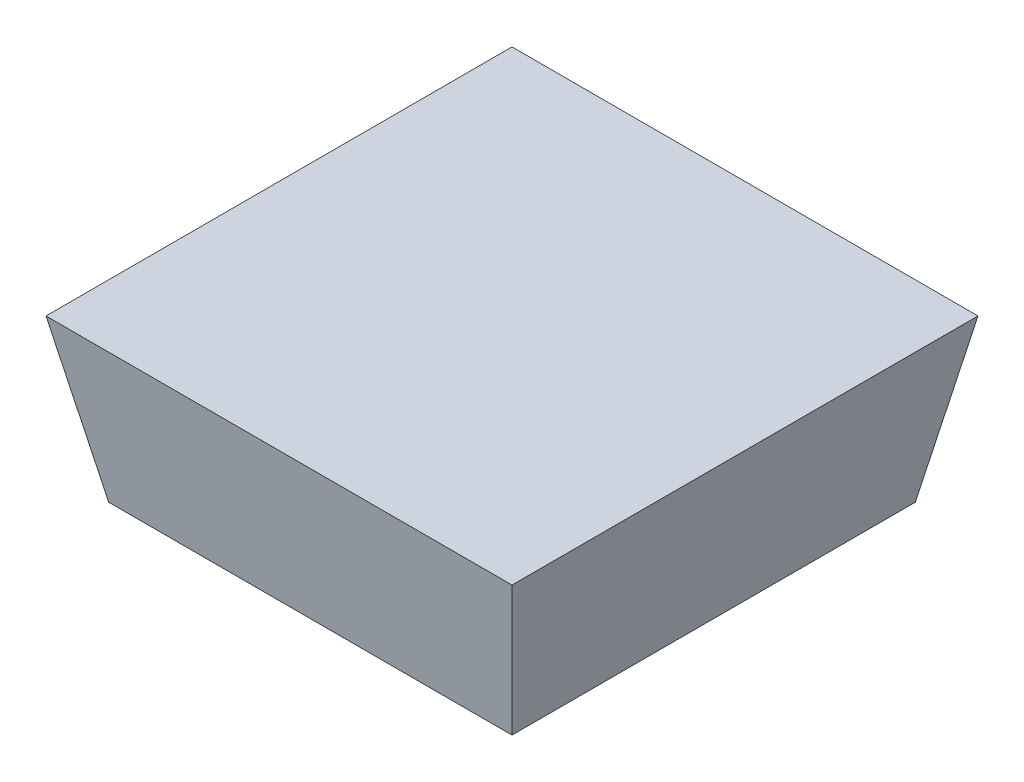
ISO-10303-21;
HEADER;
FILE_DESCRIPTION(('STEP AP214'),'2;1');
FILE_NAME('part.step','',(''),(''),'','','');
FILE_SCHEMA(('AUTOMOTIVE_DESIGN { 1 0 10303 214 1 1 1 1 }'));
ENDSEC;
DATA;
#1=APPLICATION_CONTEXT('core data for automotive mechanical design processes');
#2=APPLICATION_PROTOCOL_DEFINITION('international standard','automotive_design',2000,#1);
#3=PRODUCT_CONTEXT('',#1,'mechanical');
#4=PRODUCT('Part','Part','',(#3));
#5=PRODUCT_RELATED_PRODUCT_CATEGORY('part','',(#4));
#6=PRODUCT_DEFINITION_FORMATION('','',#4);
#7=PRODUCT_DEFINITION_CONTEXT('part definition',#1,'design');
#8=PRODUCT_DEFINITION('design','',#6,#7);
#9=PRODUCT_DEFINITION_SHAPE('','',#8);
#10=(LENGTH_UNIT() NAMED_UNIT(*) SI_UNIT(.MILLI.,.METRE.));
#11=(NAMED_UNIT(*) PLANE_ANGLE_UNIT() SI_UNIT($,.RADIAN.));
#12=(NAMED_UNIT(*) SI_UNIT($,.STERADIAN.) SOLID_ANGLE_UNIT());
#13=UNCERTAINTY_MEASURE_WITH_UNIT(LENGTH_MEASURE(1.E-05),#10,'distance_accuracy_value','');
#14=(GEOMETRIC_REPRESENTATION_CONTEXT(3) GLOBAL_UNCERTAINTY_ASSIGNED_CONTEXT((#13)) GLOBAL_UNIT_ASSIGNED_CONTEXT((#10,
#11,#12)) REPRESENTATION_CONTEXT('',''));
#15=CARTESIAN_POINT('',(0.,0.,0.));
#16=DIRECTION('',(0.,0.,1.));
#17=DIRECTION('',(1.,0.,0.));
#18=AXIS2_PLACEMENT_3D('',#15,#16,#17);
#19=CARTESIAN_POINT('',(0.,0.,0.));
#20=DIRECTION('',(0.,1.,0.));
#21=DIRECTION('',(0.,0.,1.));
#22=AXIS2_PLACEMENT_3D('',#19,#20,#21);
#23=PLANE('',#22);
#24=DIRECTION('',(0.,0.,1.));
#25=VECTOR('',#24,1.);
#26=CARTESIAN_POINT('',(-17.2924493631929,0.,-11.3623726074239));
#27=LINE('',#26,#25);
#28=CARTESIAN_POINT('',(-17.2924493631929,0.,-11.3623726074239));
#29=VERTEX_POINT('',#28);
#30=CARTESIAN_POINT('',(-17.2924493631929,0.,13.6376273925761));
#31=VERTEX_POINT('',#30);
#32=EDGE_CURVE('E193',#29,#31,#27,.T.);
#33=ORIENTED_EDGE('',*,*,#32,.F.);
#34=DIRECTION('',(-1.,0.,0.));
#35=VECTOR('',#34,1.);
#36=CARTESIAN_POINT('',(-17.2924493631929,0.,-11.3623726074239));
#37=LINE('',#36,#35);
#38=CARTESIAN_POINT('',(7.7075506368071,0.,-11.3623726074239));
#39=VERTEX_POINT('',#38);
#40=EDGE_CURVE('E225',#39,#29,#37,.T.);
#41=ORIENTED_EDGE('',*,*,#40,.F.);
#42=DIRECTION('',(0.,0.,-1.));
#43=VECTOR('',#42,1.);
#44=CARTESIAN_POINT('',(7.7075506368071,0.,-11.3623726074239));
#45=LINE('',#44,#43);
#46=CARTESIAN_POINT('',(7.70755063680711,0.,13.6376273925761));
#47=VERTEX_POINT('',#46);
#48=EDGE_CURVE('E218',#47,#39,#45,.T.);
#49=ORIENTED_EDGE('',*,*,#48,.F.);
#50=DIRECTION('',(1.,0.,0.));
#51=VECTOR('',#50,1.);
#52=CARTESIAN_POINT('',(-17.2924493631929,0.,13.6376273925761));
#53=LINE('',#52,#51);
#54=EDGE_CURVE('E216',#31,#47,#53,.T.);
#55=ORIENTED_EDGE('',*,*,#54,.F.);
#56=EDGE_LOOP('',(#33,#41,#49,#55));
#57=FACE_BOUND('',#56,.T.);
#58=DIRECTION('',(0.,0.,1.));
#59=VECTOR('',#58,1.);
#60=CARTESIAN_POINT('',(-15.1796771975961,0.,0.));
#61=LINE('',#60,#59);
#62=CARTESIAN_POINT('',(-15.1796771975961,0.,11.5248552269793));
#63=VERTEX_POINT('',#62);
#64=CARTESIAN_POINT('',(-15.1796771975961,0.,-9.24960044182707));
#65=VERTEX_POINT('',#64);
#66=EDGE_CURVE('E12',#63,#65,#61,.F.);
#67=ORIENTED_EDGE('',*,*,#66,.F.);
#68=DIRECTION('',(1.,0.,0.));
#69=VECTOR('',#68,1.);
#70=CARTESIAN_POINT('',(0.,0.,11.5248552269793));
#71=LINE('',#70,#69);
#72=CARTESIAN_POINT('',(5.59477847121029,0.,11.5248552269793));
#73=VERTEX_POINT('',#72);
#74=EDGE_CURVE('E63',#73,#63,#71,.F.);
#75=ORIENTED_EDGE('',*,*,#74,.F.);
#76=DIRECTION('',(0.,0.,-1.));
#77=VECTOR('',#76,1.);
#78=CARTESIAN_POINT('',(5.59477847121029,0.,0.));
#79=LINE('',#78,#77);
#80=CARTESIAN_POINT('',(5.59477847121029,0.,-9.24960044182707));
#81=VERTEX_POINT('',#80);
#82=EDGE_CURVE('E268',#81,#73,#79,.F.);
#83=ORIENTED_EDGE('',*,*,#82,.F.);
#84=DIRECTION('',(-1.,0.,0.));
#85=VECTOR('',#84,1.);
#86=CARTESIAN_POINT('',(0.,0.,-9.24960044182707));
#87=LINE('',#86,#85);
#88=EDGE_CURVE('E264',#65,#81,#87,.F.);
#89=ORIENTED_EDGE('',*,*,#88,.F.);
#90=EDGE_LOOP('',(#67,#75,#83,#89));
#91=FACE_BOUND('',#90,.T.);
#92=ADVANCED_FACE('F57',(#57,#91),#23,.F.);
#93=CARTESIAN_POINT('',(-17.2924493631929,0.,-11.3623726074239));
#94=DIRECTION('',(-0.981627183447664,-0.190808995376545,0.));
#95=DIRECTION('',(0.190808995376545,-0.981627183447664,0.));
#96=AXIS2_PLACEMENT_3D('',#93,#94,#95);
#97=PLANE('',#96);
#98=ORIENTED_EDGE('',*,*,#32,.T.);
#99=DIRECTION('',(0.187427559991896,-0.964231206459824,-0.187427559991896));
#100=VECTOR('',#99,1.);
#101=CARTESIAN_POINT('',(-17.2924493631929,0.,13.6376273925761));
#102=LINE('',#101,#100);
#103=CARTESIAN_POINT('',(-19.2362524545701,10.,15.5814304839533));
#104=VERTEX_POINT('',#103);
#105=EDGE_CURVE('E227',#104,#31,#102,.T.);
#106=ORIENTED_EDGE('',*,*,#105,.F.);
#107=DIRECTION('',(0.,0.,-1.));
#108=VECTOR('',#107,1.);
#109=CARTESIAN_POINT('',(-19.2362524545701,10.,-11.3623726074239));
#110=LINE('',#109,#108);
#111=CARTESIAN_POINT('',(-19.2362524545701,10.,-13.3061756988011));
#112=VERTEX_POINT('',#111);
#113=EDGE_CURVE('E223',#112,#104,#110,.F.);
#114=ORIENTED_EDGE('',*,*,#113,.F.);
#115=DIRECTION('',(0.187427559991896,-0.964231206459824,0.187427559991896));
#116=VECTOR('',#115,1.);
#117=CARTESIAN_POINT('',(-17.2924493631929,0.,-11.3623726074239));
#118=LINE('',#117,#116);
#119=EDGE_CURVE('E232',#112,#29,#118,.T.);
#120=ORIENTED_EDGE('',*,*,#119,.T.);
#121=EDGE_LOOP('',(#98,#106,#114,#120));
#122=FACE_BOUND('',#121,.T.);
#123=ADVANCED_FACE('F302',(#122),#97,.T.);
#124=CARTESIAN_POINT('',(-17.2924493631929,0.,13.6376273925761));
#125=DIRECTION('',(0.,-0.190808995376545,0.981627183447664));
#126=DIRECTION('',(0.,-0.981627183447664,-0.190808995376545));
#127=AXIS2_PLACEMENT_3D('',#124,#125,#126);
#128=PLANE('',#127);
#129=ORIENTED_EDGE('',*,*,#54,.T.);
#130=DIRECTION('',(-0.187427559991896,-0.964231206459824,-0.187427559991896));
#131=VECTOR('',#130,1.);
#132=CARTESIAN_POINT('',(6.82932338069421,-4.51808755737018,12.7594001364632));
#133=LINE('',#132,#131);
#134=CARTESIAN_POINT('',(9.6513537281843,10.,15.5814304839533));
#135=VERTEX_POINT('',#134);
#136=EDGE_CURVE('E228',#135,#47,#133,.T.);
#137=ORIENTED_EDGE('',*,*,#136,.F.);
#138=DIRECTION('',(-1.,0.,0.));
#139=VECTOR('',#138,1.);
#140=CARTESIAN_POINT('',(-17.2924493631929,10.,15.5814304839533));
#141=LINE('',#140,#139);
#142=EDGE_CURVE('E247',#104,#135,#141,.F.);
#143=ORIENTED_EDGE('',*,*,#142,.F.);
#144=ORIENTED_EDGE('',*,*,#105,.T.);
#145=EDGE_LOOP('',(#129,#137,#143,#144));
#146=FACE_BOUND('',#145,.T.);
#147=ADVANCED_FACE('F59',(#146),#128,.T.);
#148=CARTESIAN_POINT('',(7.7075506368071,0.,-11.3623726074239));
#149=DIRECTION('',(0.981627183447664,-0.190808995376545,0.));
#150=DIRECTION('',(0.190808995376545,0.981627183447664,0.));
#151=AXIS2_PLACEMENT_3D('',#148,#149,#150);
#152=PLANE('',#151);
#153=ORIENTED_EDGE('',*,*,#48,.T.);
#154=DIRECTION('',(-0.187427559991896,-0.964231206459824,0.187427559991896));
#155=VECTOR('',#154,1.);
#156=CARTESIAN_POINT('',(6.82932338069421,-4.51808755737018,-10.484145351311));
#157=LINE('',#156,#155);
#158=CARTESIAN_POINT('',(9.65135372818429,10.,-13.3061756988011));
#159=VERTEX_POINT('',#158);
#160=EDGE_CURVE('E231',#159,#39,#157,.T.);
#161=ORIENTED_EDGE('',*,*,#160,.F.);
#162=DIRECTION('',(0.,0.,1.));
#163=VECTOR('',#162,1.);
#164=CARTESIAN_POINT('',(9.65135372818429,10.,-11.3623726074239));
#165=LINE('',#164,#163);
#166=EDGE_CURVE('E249',#135,#159,#165,.F.);
#167=ORIENTED_EDGE('',*,*,#166,.F.);
#168=ORIENTED_EDGE('',*,*,#136,.T.);
#169=EDGE_LOOP('',(#153,#161,#167,#168));
#170=FACE_BOUND('',#169,.T.);
#171=ADVANCED_FACE('F320',(#170),#152,.T.);
#172=CARTESIAN_POINT('',(-17.2924493631929,0.,-11.3623726074239));
#173=DIRECTION('',(0.,-0.190808995376545,-0.981627183447664));
#174=DIRECTION('',(0.,0.981627183447664,-0.190808995376545));
#175=AXIS2_PLACEMENT_3D('',#172,#173,#174);
#176=PLANE('',#175);
#177=ORIENTED_EDGE('',*,*,#40,.T.);
#178=ORIENTED_EDGE('',*,*,#119,.F.);
#179=DIRECTION('',(1.,0.,0.));
#180=VECTOR('',#179,1.);
#181=CARTESIAN_POINT('',(-17.2924493631929,10.,-13.3061756988011));
#182=LINE('',#181,#180);
#183=EDGE_CURVE('E237',#159,#112,#182,.F.);
#184=ORIENTED_EDGE('',*,*,#183,.F.);
#185=ORIENTED_EDGE('',*,*,#160,.T.);
#186=EDGE_LOOP('',(#177,#178,#184,#185));
#187=FACE_BOUND('',#186,.T.);
#188=ADVANCED_FACE('F312',(#187),#176,.T.);
#189=CARTESIAN_POINT('',(0.,10.,0.));
#190=DIRECTION('',(0.,1.,0.));
#191=DIRECTION('',(0.,0.,1.));
#192=AXIS2_PLACEMENT_3D('',#189,#190,#191);
#193=PLANE('',#192);
#194=ORIENTED_EDGE('',*,*,#113,.T.);
#195=ORIENTED_EDGE('',*,*,#142,.T.);
#196=ORIENTED_EDGE('',*,*,#166,.T.);
#197=ORIENTED_EDGE('',*,*,#183,.T.);
#198=EDGE_LOOP('',(#194,#195,#196,#197));
#199=FACE_BOUND('',#198,.T.);
#200=ADVANCED_FACE('F315',(#199),#193,.T.);
#201=CARTESIAN_POINT('',(-17.2924493631929,-9.93981154473478,-11.3623726074239));
#202=DIRECTION('',(-0.978147600733806,0.207911690817759,0.));
#203=DIRECTION('',(-0.207911690817759,-0.978147600733806,0.));
#204=AXIS2_PLACEMENT_3D('',#201,#202,#203);
#205=PLANE('',#204);
#206=ORIENTED_EDGE('',*,*,#66,.T.);
#207=DIRECTION('',(-0.203558594952779,-0.957667894857973,-0.203558594952779));
#208=VECTOR('',#207,1.);
#209=CARTESIAN_POINT('',(-17.2924493631929,-9.93981154473478,-11.3623726074239));
#210=LINE('',#209,#208);
#211=CARTESIAN_POINT('',(-14.1041009381426,5.06018845526522,-8.17402418237355));
#212=VERTEX_POINT('',#211);
#213=EDGE_CURVE('E75',#212,#65,#210,.T.);
#214=ORIENTED_EDGE('',*,*,#213,.F.);
#215=DIRECTION('',(0.,0.,-1.));
#216=VECTOR('',#215,1.);
#217=CARTESIAN_POINT('',(-14.1041009381426,5.06018845526522,-11.3623726074239));
#218=LINE('',#217,#216);
#219=CARTESIAN_POINT('',(-14.1041009381426,5.06018845526522,10.4492789675258));
#220=VERTEX_POINT('',#219);
#221=EDGE_CURVE('E205',#212,#220,#218,.F.);
#222=ORIENTED_EDGE('',*,*,#221,.T.);
#223=DIRECTION('',(-0.203558594952779,-0.957667894857973,0.203558594952779));
#224=VECTOR('',#223,1.);
#225=CARTESIAN_POINT('',(-16.7744980934535,-7.50304240587635,13.1196761228367));
#226=LINE('',#225,#224);
#227=EDGE_CURVE('E187',#220,#63,#226,.T.);
#228=ORIENTED_EDGE('',*,*,#227,.T.);
#229=EDGE_LOOP('',(#206,#214,#222,#228));
#230=FACE_BOUND('',#229,.T.);
#231=ADVANCED_FACE('F282',(#230),#205,.F.);
#232=CARTESIAN_POINT('',(-4.79244936319291,-9.93981154473478,13.6376273925761));
#233=DIRECTION('',(0.,0.207911690817759,0.978147600733806));
#234=DIRECTION('',(0.,-0.978147600733806,0.207911690817759));
#235=AXIS2_PLACEMENT_3D('',#232,#233,#234);
#236=PLANE('',#235);
#237=ORIENTED_EDGE('',*,*,#74,.T.);
#238=ORIENTED_EDGE('',*,*,#227,.F.);
#239=DIRECTION('',(-1.,0.,0.));
#240=VECTOR('',#239,1.);
#241=CARTESIAN_POINT('',(-4.79244936319291,5.06018845526522,10.4492789675258));
#242=LINE('',#241,#240);
#243=CARTESIAN_POINT('',(4.51920221175677,5.06018845526522,10.4492789675258));
#244=VERTEX_POINT('',#243);
#245=EDGE_CURVE('E202',#220,#244,#242,.F.);
#246=ORIENTED_EDGE('',*,*,#245,.T.);
#247=DIRECTION('',(0.203558594952779,-0.957667894857973,0.203558594952779));
#248=VECTOR('',#247,1.);
#249=CARTESIAN_POINT('',(6.67164809732837,-5.06627326701791,12.6017248530974));
#250=LINE('',#249,#248);
#251=EDGE_CURVE('E188',#244,#73,#250,.T.);
#252=ORIENTED_EDGE('',*,*,#251,.T.);
#253=EDGE_LOOP('',(#237,#238,#246,#252));
#254=FACE_BOUND('',#253,.T.);
#255=ADVANCED_FACE('F273',(#254),#236,.F.);
#256=CARTESIAN_POINT('',(7.7075506368071,-9.93981154473478,-11.3623726074239));
#257=DIRECTION('',(0.978147600733806,0.207911690817759,0.));
#258=DIRECTION('',(-0.207911690817759,0.978147600733806,0.));
#259=AXIS2_PLACEMENT_3D('',#256,#257,#258);
#260=PLANE('',#259);
#261=ORIENTED_EDGE('',*,*,#82,.T.);
#262=ORIENTED_EDGE('',*,*,#251,.F.);
#263=DIRECTION('',(0.,0.,1.));
#264=VECTOR('',#263,1.);
#265=CARTESIAN_POINT('',(4.51920221175677,5.06018845526522,-11.3623726074239));
#266=LINE('',#265,#264);
#267=CARTESIAN_POINT('',(4.51920221175677,5.06018845526522,-8.17402418237355));
#268=VERTEX_POINT('',#267);
#269=EDGE_CURVE('E196',#244,#268,#266,.F.);
#270=ORIENTED_EDGE('',*,*,#269,.T.);
#271=DIRECTION('',(0.203558594952779,-0.957667894857973,-0.203558594952779));
#272=VECTOR('',#271,1.);
#273=CARTESIAN_POINT('',(7.08600911311986,-7.01568857810466,-10.7408310837366));
#274=LINE('',#273,#272);
#275=EDGE_CURVE('E194',#268,#81,#274,.T.);
#276=ORIENTED_EDGE('',*,*,#275,.T.);
#277=EDGE_LOOP('',(#261,#262,#270,#276));
#278=FACE_BOUND('',#277,.T.);
#279=ADVANCED_FACE('F287',(#278),#260,.F.);
#280=CARTESIAN_POINT('',(-7.2924493631929,-9.93981154473478,-11.3623726074239));
#281=DIRECTION('',(0.,0.207911690817759,-0.978147600733806));
#282=DIRECTION('',(0.,0.978147600733806,0.207911690817759));
#283=AXIS2_PLACEMENT_3D('',#280,#281,#282);
#284=PLANE('',#283);
#285=ORIENTED_EDGE('',*,*,#88,.T.);
#286=ORIENTED_EDGE('',*,*,#275,.F.);
#287=DIRECTION('',(1.,0.,0.));
#288=VECTOR('',#287,1.);
#289=CARTESIAN_POINT('',(-7.2924493631929,5.06018845526522,-8.17402418237355));
#290=LINE('',#289,#288);
#291=EDGE_CURVE('E182',#268,#212,#290,.F.);
#292=ORIENTED_EDGE('',*,*,#291,.T.);
#293=ORIENTED_EDGE('',*,*,#213,.T.);
#294=EDGE_LOOP('',(#285,#286,#292,#293));
#295=FACE_BOUND('',#294,.T.);
#296=ADVANCED_FACE('F281',(#295),#284,.F.);
#297=CARTESIAN_POINT('',(-6.51710999317277,5.06018845526522,-6.17402418237355));
#298=DIRECTION('',(0.,-0.20791169081776,-0.978147600733805));
#299=DIRECTION('',(0.,0.978147600733806,-0.20791169081776));
#300=AXIS2_PLACEMENT_3D('',#297,#298,#299);
#301=PLANE('',#300);
#302=DIRECTION('',(-1.,0.,0.));
#303=VECTOR('',#302,1.);
#304=CARTESIAN_POINT('',(0.,0.,-5.09844792292003));
#305=LINE('',#304,#303);
#306=CARTESIAN_POINT('',(1.44362595230325,0.,-5.09844792292003));
#307=VERTEX_POINT('',#306);
#308=CARTESIAN_POINT('',(-11.028524678689,0.,-5.09844792292003));
#309=VERTEX_POINT('',#308);
#310=EDGE_CURVE('E265',#307,#309,#305,.T.);
#311=ORIENTED_EDGE('',*,*,#310,.T.);
#312=DIRECTION('',(-0.203558594952779,0.957667894857973,-0.203558594952779));
#313=VECTOR('',#312,1.);
#314=CARTESIAN_POINT('',(-11.872597813825,3.97105188616251,-5.94252105805599));
#315=LINE('',#314,#313);
#316=CARTESIAN_POINT('',(-12.1041009381426,5.06018845526522,-6.17402418237355));
#317=VERTEX_POINT('',#316);
#318=EDGE_CURVE('E76',#309,#317,#315,.T.);
#319=ORIENTED_EDGE('',*,*,#318,.T.);
#320=DIRECTION('',(-1.,0.,0.));
#321=VECTOR('',#320,1.);
#322=CARTESIAN_POINT('',(-6.51710999317277,5.06018845526522,-6.17402418237355));
#323=LINE('',#322,#321);
#324=CARTESIAN_POINT('',(2.51920221175677,5.06018845526522,-6.17402418237355));
#325=VERTEX_POINT('',#324);
#326=EDGE_CURVE('E164',#325,#317,#323,.T.);
#327=ORIENTED_EDGE('',*,*,#326,.F.);
#328=DIRECTION('',(0.203558594952779,0.957667894857973,-0.203558594952779));
#329=VECTOR('',#328,1.);
#330=CARTESIAN_POINT('',(2.51920221175677,5.06018845526522,-6.17402418237355));
#331=LINE('',#330,#329);
#332=EDGE_CURVE('E178',#307,#325,#331,.T.);
#333=ORIENTED_EDGE('',*,*,#332,.F.);
#334=EDGE_LOOP('',(#311,#319,#327,#333));
#335=FACE_BOUND('',#334,.T.);
#336=ADVANCED_FACE('F343',(#335),#301,.T.);
#337=CARTESIAN_POINT('',(2.51920221175677,5.06018845526522,-6.17402418237355));
#338=DIRECTION('',(0.978147600733806,-0.20791169081776,0.));
#339=DIRECTION('',(0.20791169081776,0.978147600733806,0.));
#340=AXIS2_PLACEMENT_3D('',#337,#338,#339);
#341=PLANE('',#340);
#342=DIRECTION('',(0.,0.,-1.));
#343=VECTOR('',#342,1.);
#344=CARTESIAN_POINT('',(1.44362595230326,0.,0.));
#345=LINE('',#344,#343);
#346=CARTESIAN_POINT('',(1.44362595230326,0.,7.37370270807226));
#347=VERTEX_POINT('',#346);
#348=EDGE_CURVE('E259',#347,#307,#345,.T.);
#349=ORIENTED_EDGE('',*,*,#348,.T.);
#350=ORIENTED_EDGE('',*,*,#332,.T.);
#351=DIRECTION('',(0.,0.,-1.));
#352=VECTOR('',#351,1.);
#353=CARTESIAN_POINT('',(2.51920221175677,5.06018845526522,-6.17402418237355));
#354=LINE('',#353,#352);
#355=CARTESIAN_POINT('',(2.51920221175678,5.06018845526522,8.44927896752578));
#356=VERTEX_POINT('',#355);
#357=EDGE_CURVE('E172',#356,#325,#354,.T.);
#358=ORIENTED_EDGE('',*,*,#357,.F.);
#359=DIRECTION('',(0.203558594952779,0.957667894857973,0.203558594952779));
#360=VECTOR('',#359,1.);
#361=CARTESIAN_POINT('',(2.14477266133241,3.29863591846025,8.07484941710141));
#362=LINE('',#361,#360);
#363=EDGE_CURVE('E152',#347,#356,#362,.T.);
#364=ORIENTED_EDGE('',*,*,#363,.F.);
#365=EDGE_LOOP('',(#349,#350,#358,#364));
#366=FACE_BOUND('',#365,.T.);
#367=ADVANCED_FACE('F362',(#366),#341,.T.);
#368=CARTESIAN_POINT('',(-6.51710999317276,5.06018845526522,8.44927896752578));
#369=DIRECTION('',(0.,-0.20791169081776,0.978147600733805));
#370=DIRECTION('',(0.,-0.978147600733806,-0.20791169081776));
#371=AXIS2_PLACEMENT_3D('',#368,#369,#370);
#372=PLANE('',#371);
#373=DIRECTION('',(1.,0.,0.));
#374=VECTOR('',#373,1.);
#375=CARTESIAN_POINT('',(0.,0.,7.37370270807226));
#376=LINE('',#375,#374);
#377=CARTESIAN_POINT('',(-11.028524678689,0.,7.37370270807226));
#378=VERTEX_POINT('',#377);
#379=EDGE_CURVE('E258',#378,#347,#376,.T.);
#380=ORIENTED_EDGE('',*,*,#379,.T.);
#381=ORIENTED_EDGE('',*,*,#363,.T.);
#382=DIRECTION('',(1.,0.,0.));
#383=VECTOR('',#382,1.);
#384=CARTESIAN_POINT('',(-6.51710999317276,5.06018845526522,8.44927896752578));
#385=LINE('',#384,#383);
#386=CARTESIAN_POINT('',(-12.1041009381426,5.06018845526522,8.44927896752578));
#387=VERTEX_POINT('',#386);
#388=EDGE_CURVE('E165',#387,#356,#385,.T.);
#389=ORIENTED_EDGE('',*,*,#388,.F.);
#390=DIRECTION('',(-0.203558594952779,0.957667894857973,0.203558594952779));
#391=VECTOR('',#390,1.);
#392=CARTESIAN_POINT('',(-11.4981682634006,2.20949934935754,7.84334629278385));
#393=LINE('',#392,#391);
#394=EDGE_CURVE('E145',#378,#387,#393,.T.);
#395=ORIENTED_EDGE('',*,*,#394,.F.);
#396=EDGE_LOOP('',(#380,#381,#389,#395));
#397=FACE_BOUND('',#396,.T.);
#398=ADVANCED_FACE('F169',(#397),#372,.T.);
#399=CARTESIAN_POINT('',(-12.1041009381426,5.06018845526522,-6.17402418237355));
#400=DIRECTION('',(-0.978147600733806,-0.20791169081776,0.));
#401=DIRECTION('',(0.20791169081776,-0.978147600733806,0.));
#402=AXIS2_PLACEMENT_3D('',#399,#400,#401);
#403=PLANE('',#402);
#404=DIRECTION('',(0.,0.,1.));
#405=VECTOR('',#404,1.);
#406=CARTESIAN_POINT('',(-11.028524678689,0.,0.));
#407=LINE('',#406,#405);
#408=EDGE_CURVE('E149',#309,#378,#407,.T.);
#409=ORIENTED_EDGE('',*,*,#408,.T.);
#410=ORIENTED_EDGE('',*,*,#394,.T.);
#411=DIRECTION('',(0.,0.,1.));
#412=VECTOR('',#411,1.);
#413=CARTESIAN_POINT('',(-12.1041009381426,5.06018845526522,-6.17402418237355));
#414=LINE('',#413,#412);
#415=EDGE_CURVE('E150',#317,#387,#414,.T.);
#416=ORIENTED_EDGE('',*,*,#415,.F.);
#417=ORIENTED_EDGE('',*,*,#318,.F.);
#418=EDGE_LOOP('',(#409,#410,#416,#417));
#419=FACE_BOUND('',#418,.T.);
#420=ADVANCED_FACE('F148',(#419),#403,.T.);
#421=CARTESIAN_POINT('',(-4.7924493631929,5.06018845526522,2.63762739257611));
#422=DIRECTION('',(0.,1.,0.));
#423=DIRECTION('',(0.,0.,1.));
#424=AXIS2_PLACEMENT_3D('',#421,#422,#423);
#425=PLANE('',#424);
#426=ORIENTED_EDGE('',*,*,#326,.T.);
#427=ORIENTED_EDGE('',*,*,#415,.T.);
#428=ORIENTED_EDGE('',*,*,#388,.T.);
#429=ORIENTED_EDGE('',*,*,#357,.T.);
#430=EDGE_LOOP('',(#426,#427,#428,#429));
#431=FACE_BOUND('',#430,.T.);
#432=ORIENTED_EDGE('',*,*,#291,.F.);
#433=ORIENTED_EDGE('',*,*,#269,.F.);
#434=ORIENTED_EDGE('',*,*,#245,.F.);
#435=ORIENTED_EDGE('',*,*,#221,.F.);
#436=EDGE_LOOP('',(#432,#433,#434,#435));
#437=FACE_BOUND('',#436,.T.);
#438=ADVANCED_FACE('F157',(#431,#437),#425,.F.);
#439=ORIENTED_EDGE('',*,*,#310,.F.);
#440=ORIENTED_EDGE('',*,*,#348,.F.);
#441=ORIENTED_EDGE('',*,*,#379,.F.);
#442=ORIENTED_EDGE('',*,*,#408,.F.);
#443=EDGE_LOOP('',(#439,#440,#441,#442));
#444=FACE_BOUND('',#443,.T.);
#445=ADVANCED_FACE('F289',(#444),#23,.F.);
#446=CLOSED_SHELL('',(#92,#123,#147,#171,#188,#200,#231,#255,#279,#296,#336,#367,#398,#420,#438,#445));
#447=MANIFOLD_SOLID_BREP('B2',#446);
#448=ADVANCED_BREP_SHAPE_REPRESENTATION('',(#18,#447),#14);
#449=SHAPE_DEFINITION_REPRESENTATION(#9,#448);
ENDSEC;
END-ISO-10303-21;
